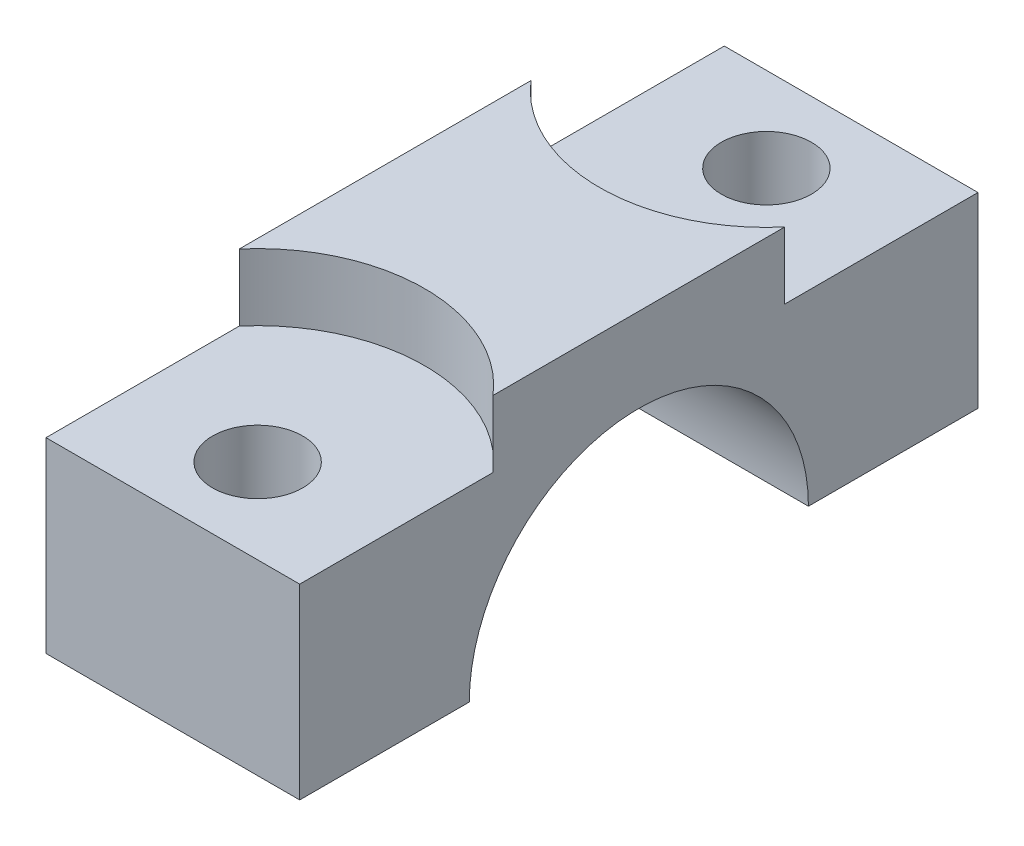
ISO-10303-21;
HEADER;
FILE_DESCRIPTION(('STEP AP214'),'2;1');
FILE_NAME('part.step','',(''),(''),'','','');
FILE_SCHEMA(('AUTOMOTIVE_DESIGN { 1 0 10303 214 1 1 1 1 }'));
ENDSEC;
DATA;
#1=APPLICATION_CONTEXT('core data for automotive mechanical design processes');
#2=APPLICATION_PROTOCOL_DEFINITION('international standard','automotive_design',2000,#1);
#3=PRODUCT_CONTEXT('',#1,'mechanical');
#4=PRODUCT('Part','Part','',(#3));
#5=PRODUCT_RELATED_PRODUCT_CATEGORY('part','',(#4));
#6=PRODUCT_DEFINITION_FORMATION('','',#4);
#7=PRODUCT_DEFINITION_CONTEXT('part definition',#1,'design');
#8=PRODUCT_DEFINITION('design','',#6,#7);
#9=PRODUCT_DEFINITION_SHAPE('','',#8);
#10=(LENGTH_UNIT() NAMED_UNIT(*) SI_UNIT(.MILLI.,.METRE.));
#11=(NAMED_UNIT(*) PLANE_ANGLE_UNIT() SI_UNIT($,.RADIAN.));
#12=(NAMED_UNIT(*) SI_UNIT($,.STERADIAN.) SOLID_ANGLE_UNIT());
#13=UNCERTAINTY_MEASURE_WITH_UNIT(LENGTH_MEASURE(1.E-05),#10,'distance_accuracy_value','');
#14=(GEOMETRIC_REPRESENTATION_CONTEXT(3) GLOBAL_UNCERTAINTY_ASSIGNED_CONTEXT((#13)) GLOBAL_UNIT_ASSIGNED_CONTEXT((#10,
#11,#12)) REPRESENTATION_CONTEXT('',''));
#15=CARTESIAN_POINT('',(0.,0.,0.));
#16=DIRECTION('',(0.,0.,1.));
#17=DIRECTION('',(1.,0.,0.));
#18=AXIS2_PLACEMENT_3D('',#15,#16,#17);
#19=CARTESIAN_POINT('',(9.5,0.,0.));
#20=DIRECTION('',(-1.,0.,0.));
#21=DIRECTION('',(0.,0.,1.));
#22=AXIS2_PLACEMENT_3D('',#19,#20,#21);
#23=CYLINDRICAL_SURFACE('',#22,12.7);
#24=CARTESIAN_POINT('',(-9.5,0.,0.));
#25=DIRECTION('',(1.,0.,0.));
#26=DIRECTION('',(0.,0.,-1.));
#27=AXIS2_PLACEMENT_3D('',#24,#25,#26);
#28=CIRCLE('',#27,12.7);
#29=CARTESIAN_POINT('',(-9.5,0.,-12.7));
#30=VERTEX_POINT('',#29);
#31=CARTESIAN_POINT('',(-9.5,0.,12.7));
#32=VERTEX_POINT('',#31);
#33=EDGE_CURVE('E153',#30,#32,#28,.T.);
#34=ORIENTED_EDGE('',*,*,#33,.F.);
#35=DIRECTION('',(-1.,0.,0.));
#36=VECTOR('',#35,1.);
#37=CARTESIAN_POINT('',(9.5,0.,-12.7));
#38=LINE('',#37,#36);
#39=CARTESIAN_POINT('',(9.5,0.,-12.7));
#40=VERTEX_POINT('',#39);
#41=EDGE_CURVE('E183',#40,#30,#38,.T.);
#42=ORIENTED_EDGE('',*,*,#41,.F.);
#43=CARTESIAN_POINT('',(9.5,0.,0.));
#44=DIRECTION('',(1.,0.,0.));
#45=DIRECTION('',(0.,0.,-1.));
#46=AXIS2_PLACEMENT_3D('',#43,#44,#45);
#47=CIRCLE('',#46,12.7);
#48=CARTESIAN_POINT('',(9.5,0.,12.7));
#49=VERTEX_POINT('',#48);
#50=EDGE_CURVE('E227',#40,#49,#47,.T.);
#51=ORIENTED_EDGE('',*,*,#50,.T.);
#52=DIRECTION('',(-1.,0.,0.));
#53=VECTOR('',#52,1.);
#54=CARTESIAN_POINT('',(9.5,0.,12.7));
#55=LINE('',#54,#53);
#56=EDGE_CURVE('E173',#49,#32,#55,.T.);
#57=ORIENTED_EDGE('',*,*,#56,.T.);
#58=EDGE_LOOP('',(#34,#42,#51,#57));
#59=FACE_BOUND('',#58,.T.);
#60=ADVANCED_FACE('F41',(#59),#23,.F.);
#61=CARTESIAN_POINT('',(9.5,0.,0.));
#62=DIRECTION('',(0.,1.,0.));
#63=DIRECTION('',(0.,0.,1.));
#64=AXIS2_PLACEMENT_3D('',#61,#62,#63);
#65=PLANE('',#64);
#66=CARTESIAN_POINT('',(0.,0.,-19.05));
#67=DIRECTION('',(0.,1.,0.));
#68=DIRECTION('',(0.,0.,1.));
#69=AXIS2_PLACEMENT_3D('',#66,#67,#68);
#70=CIRCLE('',#69,3.375);
#71=CARTESIAN_POINT('',(0.,0.,-15.675));
#72=VERTEX_POINT('',#71);
#73=EDGE_CURVE('E137',#72,#72,#70,.T.);
#74=ORIENTED_EDGE('',*,*,#73,.T.);
#75=EDGE_LOOP('',(#74));
#76=FACE_BOUND('',#75,.T.);
#77=DIRECTION('',(0.,0.,-1.));
#78=VECTOR('',#77,1.);
#79=CARTESIAN_POINT('',(-9.5,0.,0.));
#80=LINE('',#79,#78);
#81=CARTESIAN_POINT('',(-9.5,0.,-25.4));
#82=VERTEX_POINT('',#81);
#83=EDGE_CURVE('E157',#30,#82,#80,.T.);
#84=ORIENTED_EDGE('',*,*,#83,.T.);
#85=DIRECTION('',(-1.,0.,0.));
#86=VECTOR('',#85,1.);
#87=CARTESIAN_POINT('',(9.5,0.,-25.4));
#88=LINE('',#87,#86);
#89=CARTESIAN_POINT('',(9.5,0.,-25.4));
#90=VERTEX_POINT('',#89);
#91=EDGE_CURVE('E179',#90,#82,#88,.T.);
#92=ORIENTED_EDGE('',*,*,#91,.F.);
#93=DIRECTION('',(0.,0.,-1.));
#94=VECTOR('',#93,1.);
#95=CARTESIAN_POINT('',(9.5,0.,0.));
#96=LINE('',#95,#94);
#97=EDGE_CURVE('E149',#40,#90,#96,.T.);
#98=ORIENTED_EDGE('',*,*,#97,.F.);
#99=ORIENTED_EDGE('',*,*,#41,.T.);
#100=EDGE_LOOP('',(#84,#92,#98,#99));
#101=FACE_BOUND('',#100,.T.);
#102=ADVANCED_FACE('F246',(#76,#101),#65,.F.);
#103=CARTESIAN_POINT('',(9.5,0.,-25.4));
#104=DIRECTION('',(0.,0.,1.));
#105=DIRECTION('',(0.,-1.,0.));
#106=AXIS2_PLACEMENT_3D('',#103,#104,#105);
#107=PLANE('',#106);
#108=DIRECTION('',(0.,1.,0.));
#109=VECTOR('',#108,1.);
#110=CARTESIAN_POINT('',(-9.5,0.,-25.4));
#111=LINE('',#110,#109);
#112=CARTESIAN_POINT('',(-9.5,14.,-25.4));
#113=VERTEX_POINT('',#112);
#114=EDGE_CURVE('E161',#82,#113,#111,.T.);
#115=ORIENTED_EDGE('',*,*,#114,.T.);
#116=DIRECTION('',(1.,0.,0.));
#117=VECTOR('',#116,1.);
#118=CARTESIAN_POINT('',(9.5,14.,-25.4));
#119=LINE('',#118,#117);
#120=CARTESIAN_POINT('',(9.5,14.,-25.4));
#121=VERTEX_POINT('',#120);
#122=EDGE_CURVE('E136',#113,#121,#119,.T.);
#123=ORIENTED_EDGE('',*,*,#122,.T.);
#124=DIRECTION('',(0.,1.,0.));
#125=VECTOR('',#124,1.);
#126=CARTESIAN_POINT('',(9.5,0.,-25.4));
#127=LINE('',#126,#125);
#128=EDGE_CURVE('E142',#90,#121,#127,.T.);
#129=ORIENTED_EDGE('',*,*,#128,.F.);
#130=ORIENTED_EDGE('',*,*,#91,.T.);
#131=EDGE_LOOP('',(#115,#123,#129,#130));
#132=FACE_BOUND('',#131,.T.);
#133=ADVANCED_FACE('F250',(#132),#107,.F.);
#134=CARTESIAN_POINT('',(9.5,19.,0.));
#135=DIRECTION('',(0.,1.,0.));
#136=DIRECTION('',(0.,0.,1.));
#137=AXIS2_PLACEMENT_3D('',#134,#135,#136);
#138=PLANE('',#137);
#139=CARTESIAN_POINT('',(0.,19.,-19.05));
#140=DIRECTION('',(0.,1.,0.));
#141=DIRECTION('',(0.,0.,1.));
#142=AXIS2_PLACEMENT_3D('',#139,#140,#141);
#143=CIRCLE('',#142,12.5);
#144=CARTESIAN_POINT('',(-9.5,19.,-10.925961595364));
#145=VERTEX_POINT('',#144);
#146=CARTESIAN_POINT('',(9.5,19.,-10.925961595364));
#147=VERTEX_POINT('',#146);
#148=EDGE_CURVE('E116',#145,#147,#143,.T.);
#149=ORIENTED_EDGE('',*,*,#148,.F.);
#150=DIRECTION('',(0.,0.,-1.));
#151=VECTOR('',#150,1.);
#152=CARTESIAN_POINT('',(-9.5,19.,0.));
#153=LINE('',#152,#151);
#154=CARTESIAN_POINT('',(-9.5,19.,10.925961595364));
#155=VERTEX_POINT('',#154);
#156=EDGE_CURVE('E166',#155,#145,#153,.T.);
#157=ORIENTED_EDGE('',*,*,#156,.F.);
#158=CARTESIAN_POINT('',(0.,19.,19.05));
#159=DIRECTION('',(0.,1.,0.));
#160=DIRECTION('',(0.,0.,1.));
#161=AXIS2_PLACEMENT_3D('',#158,#159,#160);
#162=CIRCLE('',#161,12.5);
#163=CARTESIAN_POINT('',(9.5,19.,10.925961595364));
#164=VERTEX_POINT('',#163);
#165=EDGE_CURVE('E64',#164,#155,#162,.T.);
#166=ORIENTED_EDGE('',*,*,#165,.F.);
#167=DIRECTION('',(0.,0.,-1.));
#168=VECTOR('',#167,1.);
#169=CARTESIAN_POINT('',(9.5,19.,0.));
#170=LINE('',#169,#168);
#171=EDGE_CURVE('E132',#164,#147,#170,.T.);
#172=ORIENTED_EDGE('',*,*,#171,.T.);
#173=EDGE_LOOP('',(#149,#157,#166,#172));
#174=FACE_BOUND('',#173,.T.);
#175=ADVANCED_FACE('F139',(#174),#138,.T.);
#176=CARTESIAN_POINT('',(9.5,0.,25.4));
#177=DIRECTION('',(0.,0.,1.));
#178=DIRECTION('',(1.,0.,0.));
#179=AXIS2_PLACEMENT_3D('',#176,#177,#178);
#180=PLANE('',#179);
#181=DIRECTION('',(1.,0.,0.));
#182=VECTOR('',#181,1.);
#183=CARTESIAN_POINT('',(9.5,14.,25.4));
#184=LINE('',#183,#182);
#185=CARTESIAN_POINT('',(-9.5,14.,25.4));
#186=VERTEX_POINT('',#185);
#187=CARTESIAN_POINT('',(9.5,14.,25.4));
#188=VERTEX_POINT('',#187);
#189=EDGE_CURVE('E222',#186,#188,#184,.T.);
#190=ORIENTED_EDGE('',*,*,#189,.F.);
#191=DIRECTION('',(0.,1.,0.));
#192=VECTOR('',#191,1.);
#193=CARTESIAN_POINT('',(-9.5,0.,25.4));
#194=LINE('',#193,#192);
#195=CARTESIAN_POINT('',(-9.5,0.,25.4));
#196=VERTEX_POINT('',#195);
#197=EDGE_CURVE('E169',#196,#186,#194,.T.);
#198=ORIENTED_EDGE('',*,*,#197,.F.);
#199=DIRECTION('',(-1.,0.,0.));
#200=VECTOR('',#199,1.);
#201=CARTESIAN_POINT('',(9.5,0.,25.4));
#202=LINE('',#201,#200);
#203=CARTESIAN_POINT('',(9.5,0.,25.4));
#204=VERTEX_POINT('',#203);
#205=EDGE_CURVE('E176',#204,#196,#202,.T.);
#206=ORIENTED_EDGE('',*,*,#205,.F.);
#207=DIRECTION('',(0.,1.,0.));
#208=VECTOR('',#207,1.);
#209=CARTESIAN_POINT('',(9.5,0.,25.4));
#210=LINE('',#209,#208);
#211=EDGE_CURVE('E141',#204,#188,#210,.T.);
#212=ORIENTED_EDGE('',*,*,#211,.T.);
#213=EDGE_LOOP('',(#190,#198,#206,#212));
#214=FACE_BOUND('',#213,.T.);
#215=ADVANCED_FACE('F291',(#214),#180,.T.);
#216=CARTESIAN_POINT('',(0.,0.,19.05));
#217=DIRECTION('',(0.,1.,0.));
#218=DIRECTION('',(0.,0.,1.));
#219=AXIS2_PLACEMENT_3D('',#216,#217,#218);
#220=CIRCLE('',#219,3.375);
#221=CARTESIAN_POINT('',(0.,0.,22.425));
#222=VERTEX_POINT('',#221);
#223=EDGE_CURVE('E211',#222,#222,#220,.T.);
#224=ORIENTED_EDGE('',*,*,#223,.T.);
#225=EDGE_LOOP('',(#224));
#226=FACE_BOUND('',#225,.T.);
#227=EDGE_CURVE('E162',#196,#32,#80,.T.);
#228=ORIENTED_EDGE('',*,*,#227,.T.);
#229=ORIENTED_EDGE('',*,*,#56,.F.);
#230=EDGE_CURVE('E147',#204,#49,#96,.T.);
#231=ORIENTED_EDGE('',*,*,#230,.F.);
#232=ORIENTED_EDGE('',*,*,#205,.T.);
#233=EDGE_LOOP('',(#228,#229,#231,#232));
#234=FACE_BOUND('',#233,.T.);
#235=ADVANCED_FACE('F240',(#226,#234),#65,.F.);
#236=CARTESIAN_POINT('',(9.5,0.,0.));
#237=DIRECTION('',(1.,0.,0.));
#238=DIRECTION('',(0.,0.,-1.));
#239=AXIS2_PLACEMENT_3D('',#236,#237,#238);
#240=PLANE('',#239);
#241=DIRECTION('',(0.,0.,-1.));
#242=VECTOR('',#241,1.);
#243=CARTESIAN_POINT('',(9.5,14.,0.));
#244=LINE('',#243,#242);
#245=CARTESIAN_POINT('',(9.5,14.,-10.925961595364));
#246=VERTEX_POINT('',#245);
#247=EDGE_CURVE('E134',#246,#121,#244,.T.);
#248=ORIENTED_EDGE('',*,*,#247,.F.);
#249=DIRECTION('',(0.,1.,0.));
#250=VECTOR('',#249,1.);
#251=CARTESIAN_POINT('',(9.5,19.,-10.925961595364));
#252=LINE('',#251,#250);
#253=EDGE_CURVE('E119',#147,#246,#252,.F.);
#254=ORIENTED_EDGE('',*,*,#253,.F.);
#255=ORIENTED_EDGE('',*,*,#171,.F.);
#256=DIRECTION('',(0.,1.,0.));
#257=VECTOR('',#256,1.);
#258=CARTESIAN_POINT('',(9.5,19.,10.925961595364));
#259=LINE('',#258,#257);
#260=CARTESIAN_POINT('',(9.5,14.,10.925961595364));
#261=VERTEX_POINT('',#260);
#262=EDGE_CURVE('E219',#261,#164,#259,.T.);
#263=ORIENTED_EDGE('',*,*,#262,.F.);
#264=DIRECTION('',(0.,0.,-1.));
#265=VECTOR('',#264,1.);
#266=CARTESIAN_POINT('',(9.5,14.,0.));
#267=LINE('',#266,#265);
#268=EDGE_CURVE('E158',#188,#261,#267,.T.);
#269=ORIENTED_EDGE('',*,*,#268,.F.);
#270=ORIENTED_EDGE('',*,*,#211,.F.);
#271=ORIENTED_EDGE('',*,*,#230,.T.);
#272=ORIENTED_EDGE('',*,*,#50,.F.);
#273=ORIENTED_EDGE('',*,*,#97,.T.);
#274=ORIENTED_EDGE('',*,*,#128,.T.);
#275=EDGE_LOOP('',(#248,#254,#255,#263,#269,#270,#271,#272,#273,#274));
#276=FACE_BOUND('',#275,.T.);
#277=ADVANCED_FACE('F130',(#276),#240,.T.);
#278=CARTESIAN_POINT('',(-9.5,0.,0.));
#279=DIRECTION('',(1.,0.,0.));
#280=DIRECTION('',(0.,0.,-1.));
#281=AXIS2_PLACEMENT_3D('',#278,#279,#280);
#282=PLANE('',#281);
#283=DIRECTION('',(0.,1.,0.));
#284=VECTOR('',#283,1.);
#285=CARTESIAN_POINT('',(-9.5,19.,-10.925961595364));
#286=LINE('',#285,#284);
#287=CARTESIAN_POINT('',(-9.5,14.,-10.925961595364));
#288=VERTEX_POINT('',#287);
#289=EDGE_CURVE('E49',#145,#288,#286,.F.);
#290=ORIENTED_EDGE('',*,*,#289,.T.);
#291=DIRECTION('',(0.,0.,-1.));
#292=VECTOR('',#291,1.);
#293=CARTESIAN_POINT('',(-9.5,14.,0.));
#294=LINE('',#293,#292);
#295=EDGE_CURVE('E11',#288,#113,#294,.T.);
#296=ORIENTED_EDGE('',*,*,#295,.T.);
#297=ORIENTED_EDGE('',*,*,#114,.F.);
#298=ORIENTED_EDGE('',*,*,#83,.F.);
#299=ORIENTED_EDGE('',*,*,#33,.T.);
#300=ORIENTED_EDGE('',*,*,#227,.F.);
#301=ORIENTED_EDGE('',*,*,#197,.T.);
#302=DIRECTION('',(0.,0.,-1.));
#303=VECTOR('',#302,1.);
#304=CARTESIAN_POINT('',(-9.5,14.,0.));
#305=LINE('',#304,#303);
#306=CARTESIAN_POINT('',(-9.5,14.,10.925961595364));
#307=VERTEX_POINT('',#306);
#308=EDGE_CURVE('E189',#186,#307,#305,.T.);
#309=ORIENTED_EDGE('',*,*,#308,.T.);
#310=DIRECTION('',(0.,1.,0.));
#311=VECTOR('',#310,1.);
#312=CARTESIAN_POINT('',(-9.5,19.,10.925961595364));
#313=LINE('',#312,#311);
#314=EDGE_CURVE('E186',#307,#155,#313,.T.);
#315=ORIENTED_EDGE('',*,*,#314,.T.);
#316=ORIENTED_EDGE('',*,*,#156,.T.);
#317=EDGE_LOOP('',(#290,#296,#297,#298,#299,#300,#301,#309,#315,#316));
#318=FACE_BOUND('',#317,.T.);
#319=ADVANCED_FACE('F194',(#318),#282,.F.);
#320=CARTESIAN_POINT('',(0.,19.,19.05));
#321=DIRECTION('',(0.,1.,0.));
#322=DIRECTION('',(0.,0.,1.));
#323=AXIS2_PLACEMENT_3D('',#320,#321,#322);
#324=CYLINDRICAL_SURFACE('',#323,3.375);
#325=ORIENTED_EDGE('',*,*,#223,.F.);
#326=EDGE_LOOP('',(#325));
#327=FACE_BOUND('',#326,.T.);
#328=CARTESIAN_POINT('',(0.,14.,19.05));
#329=DIRECTION('',(0.,1.,0.));
#330=DIRECTION('',(0.,0.,1.));
#331=AXIS2_PLACEMENT_3D('',#328,#329,#330);
#332=CIRCLE('',#331,3.37500000000001);
#333=CARTESIAN_POINT('',(0.,14.,22.425));
#334=VERTEX_POINT('',#333);
#335=EDGE_CURVE('E206',#334,#334,#332,.T.);
#336=ORIENTED_EDGE('',*,*,#335,.T.);
#337=EDGE_LOOP('',(#336));
#338=FACE_BOUND('',#337,.T.);
#339=ADVANCED_FACE('F301',(#327,#338),#324,.F.);
#340=CARTESIAN_POINT('',(3.37500000000001,14.,19.05));
#341=DIRECTION('',(0.,-1.,0.));
#342=DIRECTION('',(0.,0.,-1.));
#343=AXIS2_PLACEMENT_3D('',#340,#341,#342);
#344=PLANE('',#343);
#345=ORIENTED_EDGE('',*,*,#268,.T.);
#346=CARTESIAN_POINT('',(0.,14.,19.05));
#347=DIRECTION('',(0.,1.,0.));
#348=DIRECTION('',(0.,0.,1.));
#349=AXIS2_PLACEMENT_3D('',#346,#347,#348);
#350=CIRCLE('',#349,12.5);
#351=EDGE_CURVE('E199',#261,#307,#350,.T.);
#352=ORIENTED_EDGE('',*,*,#351,.T.);
#353=ORIENTED_EDGE('',*,*,#308,.F.);
#354=ORIENTED_EDGE('',*,*,#189,.T.);
#355=EDGE_LOOP('',(#345,#352,#353,#354));
#356=FACE_BOUND('',#355,.T.);
#357=ORIENTED_EDGE('',*,*,#335,.F.);
#358=EDGE_LOOP('',(#357));
#359=FACE_BOUND('',#358,.T.);
#360=ADVANCED_FACE('F201',(#356,#359),#344,.F.);
#361=CARTESIAN_POINT('',(0.,19.,19.05));
#362=DIRECTION('',(0.,1.,0.));
#363=DIRECTION('',(0.,0.,1.));
#364=AXIS2_PLACEMENT_3D('',#361,#362,#363);
#365=CYLINDRICAL_SURFACE('',#364,12.5);
#366=ORIENTED_EDGE('',*,*,#262,.T.);
#367=ORIENTED_EDGE('',*,*,#165,.T.);
#368=ORIENTED_EDGE('',*,*,#314,.F.);
#369=ORIENTED_EDGE('',*,*,#351,.F.);
#370=EDGE_LOOP('',(#366,#367,#368,#369));
#371=FACE_BOUND('',#370,.T.);
#372=ADVANCED_FACE('F198',(#371),#365,.F.);
#373=CARTESIAN_POINT('',(0.,19.,-19.05));
#374=DIRECTION('',(0.,1.,0.));
#375=DIRECTION('',(0.,0.,1.));
#376=AXIS2_PLACEMENT_3D('',#373,#374,#375);
#377=CYLINDRICAL_SURFACE('',#376,3.375);
#378=ORIENTED_EDGE('',*,*,#73,.F.);
#379=EDGE_LOOP('',(#378));
#380=FACE_BOUND('',#379,.T.);
#381=CARTESIAN_POINT('',(0.,14.,-19.05));
#382=DIRECTION('',(0.,1.,0.));
#383=DIRECTION('',(0.,0.,1.));
#384=AXIS2_PLACEMENT_3D('',#381,#382,#383);
#385=CIRCLE('',#384,3.37500000000001);
#386=CARTESIAN_POINT('',(0.,14.,-15.675));
#387=VERTEX_POINT('',#386);
#388=EDGE_CURVE('E259',#387,#387,#385,.T.);
#389=ORIENTED_EDGE('',*,*,#388,.T.);
#390=EDGE_LOOP('',(#389));
#391=FACE_BOUND('',#390,.T.);
#392=ADVANCED_FACE('F267',(#380,#391),#377,.F.);
#393=CARTESIAN_POINT('',(3.37500000000001,14.,-19.05));
#394=DIRECTION('',(0.,-1.,0.));
#395=DIRECTION('',(0.,0.,-1.));
#396=AXIS2_PLACEMENT_3D('',#393,#394,#395);
#397=PLANE('',#396);
#398=ORIENTED_EDGE('',*,*,#247,.T.);
#399=ORIENTED_EDGE('',*,*,#122,.F.);
#400=ORIENTED_EDGE('',*,*,#295,.F.);
#401=CARTESIAN_POINT('',(0.,14.,-19.05));
#402=DIRECTION('',(0.,1.,0.));
#403=DIRECTION('',(0.,0.,1.));
#404=AXIS2_PLACEMENT_3D('',#401,#402,#403);
#405=CIRCLE('',#404,12.5);
#406=EDGE_CURVE('E56',#288,#246,#405,.T.);
#407=ORIENTED_EDGE('',*,*,#406,.T.);
#408=EDGE_LOOP('',(#398,#399,#400,#407));
#409=FACE_BOUND('',#408,.T.);
#410=ORIENTED_EDGE('',*,*,#388,.F.);
#411=EDGE_LOOP('',(#410));
#412=FACE_BOUND('',#411,.T.);
#413=ADVANCED_FACE('F264',(#409,#412),#397,.F.);
#414=CARTESIAN_POINT('',(0.,19.,-19.05));
#415=DIRECTION('',(0.,1.,0.));
#416=DIRECTION('',(0.,0.,1.));
#417=AXIS2_PLACEMENT_3D('',#414,#415,#416);
#418=CYLINDRICAL_SURFACE('',#417,12.5);
#419=ORIENTED_EDGE('',*,*,#253,.T.);
#420=ORIENTED_EDGE('',*,*,#406,.F.);
#421=ORIENTED_EDGE('',*,*,#289,.F.);
#422=ORIENTED_EDGE('',*,*,#148,.T.);
#423=EDGE_LOOP('',(#419,#420,#421,#422));
#424=FACE_BOUND('',#423,.T.);
#425=ADVANCED_FACE('F118',(#424),#418,.F.);
#426=CLOSED_SHELL('',(#60,#102,#133,#175,#215,#235,#277,#319,#339,#360,#372,#392,#413,#425));
#427=MANIFOLD_SOLID_BREP('B2',#426);
#428=ADVANCED_BREP_SHAPE_REPRESENTATION('',(#18,#427),#14);
#429=SHAPE_DEFINITION_REPRESENTATION(#9,#428);
ENDSEC;
END-ISO-10303-21;
